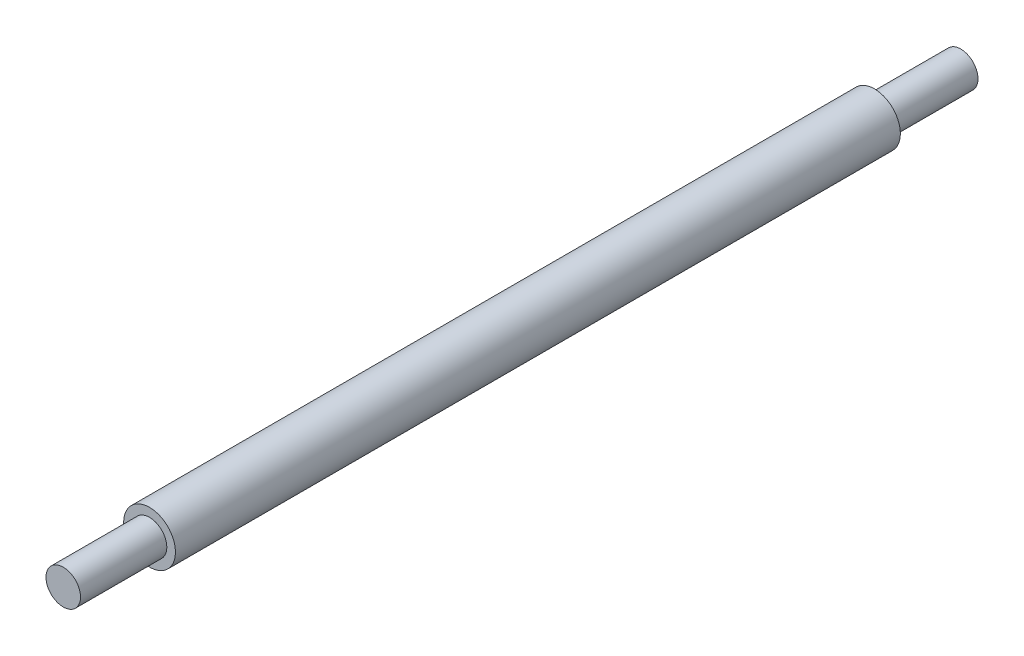
ISO-10303-21;
HEADER;
FILE_DESCRIPTION(('STEP AP214'),'2;1');
FILE_NAME('part.step','',(''),(''),'','','');
FILE_SCHEMA(('AUTOMOTIVE_DESIGN { 1 0 10303 214 1 1 1 1 }'));
ENDSEC;
DATA;
#1=APPLICATION_CONTEXT('core data for automotive mechanical design processes');
#2=APPLICATION_PROTOCOL_DEFINITION('international standard','automotive_design',2000,#1);
#3=PRODUCT_CONTEXT('',#1,'mechanical');
#4=PRODUCT('Part','Part','',(#3));
#5=PRODUCT_RELATED_PRODUCT_CATEGORY('part','',(#4));
#6=PRODUCT_DEFINITION_FORMATION('','',#4);
#7=PRODUCT_DEFINITION_CONTEXT('part definition',#1,'design');
#8=PRODUCT_DEFINITION('design','',#6,#7);
#9=PRODUCT_DEFINITION_SHAPE('','',#8);
#10=(LENGTH_UNIT() NAMED_UNIT(*) SI_UNIT(.MILLI.,.METRE.));
#11=(NAMED_UNIT(*) PLANE_ANGLE_UNIT() SI_UNIT($,.RADIAN.));
#12=(NAMED_UNIT(*) SI_UNIT($,.STERADIAN.) SOLID_ANGLE_UNIT());
#13=UNCERTAINTY_MEASURE_WITH_UNIT(LENGTH_MEASURE(1.E-05),#10,'distance_accuracy_value','');
#14=(GEOMETRIC_REPRESENTATION_CONTEXT(3) GLOBAL_UNCERTAINTY_ASSIGNED_CONTEXT((#13)) GLOBAL_UNIT_ASSIGNED_CONTEXT((#10,
#11,#12)) REPRESENTATION_CONTEXT('',''));
#15=CARTESIAN_POINT('',(0.,0.,0.));
#16=DIRECTION('',(0.,0.,1.));
#17=DIRECTION('',(1.,0.,0.));
#18=AXIS2_PLACEMENT_3D('',#15,#16,#17);
#19=CARTESIAN_POINT('',(0.,0.,0.));
#20=DIRECTION('',(0.,0.,1.));
#21=DIRECTION('',(0.,-1.,0.));
#22=AXIS2_PLACEMENT_3D('',#19,#20,#21);
#23=PLANE('',#22);
#24=CARTESIAN_POINT('',(0.,0.,0.));
#25=DIRECTION('',(0.,0.,-1.));
#26=DIRECTION('',(0.,1.,0.));
#27=AXIS2_PLACEMENT_3D('',#24,#25,#26);
#28=CIRCLE('',#27,2.00000000000004);
#29=CARTESIAN_POINT('',(0.,2.00000000000004,0.));
#30=VERTEX_POINT('',#29);
#31=EDGE_CURVE('E10',#30,#30,#28,.T.);
#32=ORIENTED_EDGE('',*,*,#31,.F.);
#33=EDGE_LOOP('',(#32));
#34=FACE_BOUND('',#33,.T.);
#35=ADVANCED_FACE('F35',(#34),#23,.T.);
#36=CARTESIAN_POINT('',(0.,0.,-104.));
#37=DIRECTION('',(0.,0.,-1.));
#38=DIRECTION('',(0.,1.,0.));
#39=AXIS2_PLACEMENT_3D('',#36,#37,#38);
#40=CYLINDRICAL_SURFACE('',#39,2.00000000000004);
#41=ORIENTED_EDGE('',*,*,#31,.T.);
#42=EDGE_LOOP('',(#41));
#43=FACE_BOUND('',#42,.T.);
#44=CARTESIAN_POINT('',(0.,0.,-9.99999999999999));
#45=DIRECTION('',(0.,0.,-1.));
#46=DIRECTION('',(0.,1.,0.));
#47=AXIS2_PLACEMENT_3D('',#44,#45,#46);
#48=CIRCLE('',#47,2.00000000000003);
#49=CARTESIAN_POINT('',(0.,2.00000000000004,-9.99999999999999));
#50=VERTEX_POINT('',#49);
#51=EDGE_CURVE('E41',#50,#50,#48,.T.);
#52=ORIENTED_EDGE('',*,*,#51,.F.);
#53=EDGE_LOOP('',(#52));
#54=FACE_BOUND('',#53,.T.);
#55=ADVANCED_FACE('F77',(#43,#54),#40,.T.);
#56=CARTESIAN_POINT('',(0.,2.00000000000004,-10.));
#57=DIRECTION('',(0.,0.,1.));
#58=DIRECTION('',(0.,-1.,0.));
#59=AXIS2_PLACEMENT_3D('',#56,#57,#58);
#60=PLANE('',#59);
#61=ORIENTED_EDGE('',*,*,#51,.T.);
#62=EDGE_LOOP('',(#61));
#63=FACE_BOUND('',#62,.T.);
#64=CARTESIAN_POINT('',(0.,0.,-9.99999999999999));
#65=DIRECTION('',(0.,0.,-1.));
#66=DIRECTION('',(0.,1.,0.));
#67=AXIS2_PLACEMENT_3D('',#64,#65,#66);
#68=CIRCLE('',#67,2.99999999999998);
#69=CARTESIAN_POINT('',(0.,2.99999999999999,-9.99999999999999));
#70=VERTEX_POINT('',#69);
#71=EDGE_CURVE('E45',#70,#70,#68,.T.);
#72=ORIENTED_EDGE('',*,*,#71,.F.);
#73=EDGE_LOOP('',(#72));
#74=FACE_BOUND('',#73,.T.);
#75=ADVANCED_FACE('F82',(#63,#74),#60,.T.);
#76=CARTESIAN_POINT('',(0.,0.,-104.));
#77=DIRECTION('',(0.,0.,-1.));
#78=DIRECTION('',(0.,1.,0.));
#79=AXIS2_PLACEMENT_3D('',#76,#77,#78);
#80=CYLINDRICAL_SURFACE('',#79,2.99999999999997);
#81=ORIENTED_EDGE('',*,*,#71,.T.);
#82=EDGE_LOOP('',(#81));
#83=FACE_BOUND('',#82,.T.);
#84=CARTESIAN_POINT('',(0.,0.,-94.));
#85=DIRECTION('',(0.,0.,-1.));
#86=DIRECTION('',(0.,1.,0.));
#87=AXIS2_PLACEMENT_3D('',#84,#85,#86);
#88=CIRCLE('',#87,2.99999999999995);
#89=CARTESIAN_POINT('',(0.,2.99999999999999,-94.));
#90=VERTEX_POINT('',#89);
#91=EDGE_CURVE('E49',#90,#90,#88,.T.);
#92=ORIENTED_EDGE('',*,*,#91,.F.);
#93=EDGE_LOOP('',(#92));
#94=FACE_BOUND('',#93,.T.);
#95=ADVANCED_FACE('F73',(#83,#94),#80,.T.);
#96=CARTESIAN_POINT('',(0.,2.99999999999999,-94.));
#97=DIRECTION('',(0.,0.,-1.));
#98=DIRECTION('',(0.,1.,0.));
#99=AXIS2_PLACEMENT_3D('',#96,#97,#98);
#100=PLANE('',#99);
#101=ORIENTED_EDGE('',*,*,#91,.T.);
#102=EDGE_LOOP('',(#101));
#103=FACE_BOUND('',#102,.T.);
#104=CARTESIAN_POINT('',(0.,0.,-94.));
#105=DIRECTION('',(0.,0.,-1.));
#106=DIRECTION('',(0.,1.,0.));
#107=AXIS2_PLACEMENT_3D('',#104,#105,#106);
#108=CIRCLE('',#107,2.);
#109=CARTESIAN_POINT('',(0.,2.00000000000004,-94.));
#110=VERTEX_POINT('',#109);
#111=EDGE_CURVE('E54',#110,#110,#108,.T.);
#112=ORIENTED_EDGE('',*,*,#111,.F.);
#113=EDGE_LOOP('',(#112));
#114=FACE_BOUND('',#113,.T.);
#115=ADVANCED_FACE('F65',(#103,#114),#100,.T.);
#116=CARTESIAN_POINT('',(0.,0.,-104.));
#117=DIRECTION('',(0.,0.,-1.));
#118=DIRECTION('',(0.,1.,0.));
#119=AXIS2_PLACEMENT_3D('',#116,#117,#118);
#120=CYLINDRICAL_SURFACE('',#119,2.);
#121=ORIENTED_EDGE('',*,*,#111,.T.);
#122=EDGE_LOOP('',(#121));
#123=FACE_BOUND('',#122,.T.);
#124=CARTESIAN_POINT('',(0.,0.,-104.));
#125=DIRECTION('',(0.,0.,-1.));
#126=DIRECTION('',(0.,1.,0.));
#127=AXIS2_PLACEMENT_3D('',#124,#125,#126);
#128=CIRCLE('',#127,2.);
#129=CARTESIAN_POINT('',(0.,2.00000000000004,-104.));
#130=VERTEX_POINT('',#129);
#131=EDGE_CURVE('E57',#130,#130,#128,.T.);
#132=ORIENTED_EDGE('',*,*,#131,.F.);
#133=EDGE_LOOP('',(#132));
#134=FACE_BOUND('',#133,.T.);
#135=ADVANCED_FACE('F63',(#123,#134),#120,.T.);
#136=CARTESIAN_POINT('',(0.,2.00000000000004,-104.));
#137=DIRECTION('',(0.,0.,-1.));
#138=DIRECTION('',(0.,1.,0.));
#139=AXIS2_PLACEMENT_3D('',#136,#137,#138);
#140=PLANE('',#139);
#141=ORIENTED_EDGE('',*,*,#131,.T.);
#142=EDGE_LOOP('',(#141));
#143=FACE_BOUND('',#142,.T.);
#144=ADVANCED_FACE('F61',(#143),#140,.T.);
#145=CLOSED_SHELL('',(#35,#55,#75,#95,#115,#135,#144));
#146=MANIFOLD_SOLID_BREP('B2',#145);
#147=ADVANCED_BREP_SHAPE_REPRESENTATION('',(#18,#146),#14);
#148=SHAPE_DEFINITION_REPRESENTATION(#9,#147);
ENDSEC;
END-ISO-10303-21;
